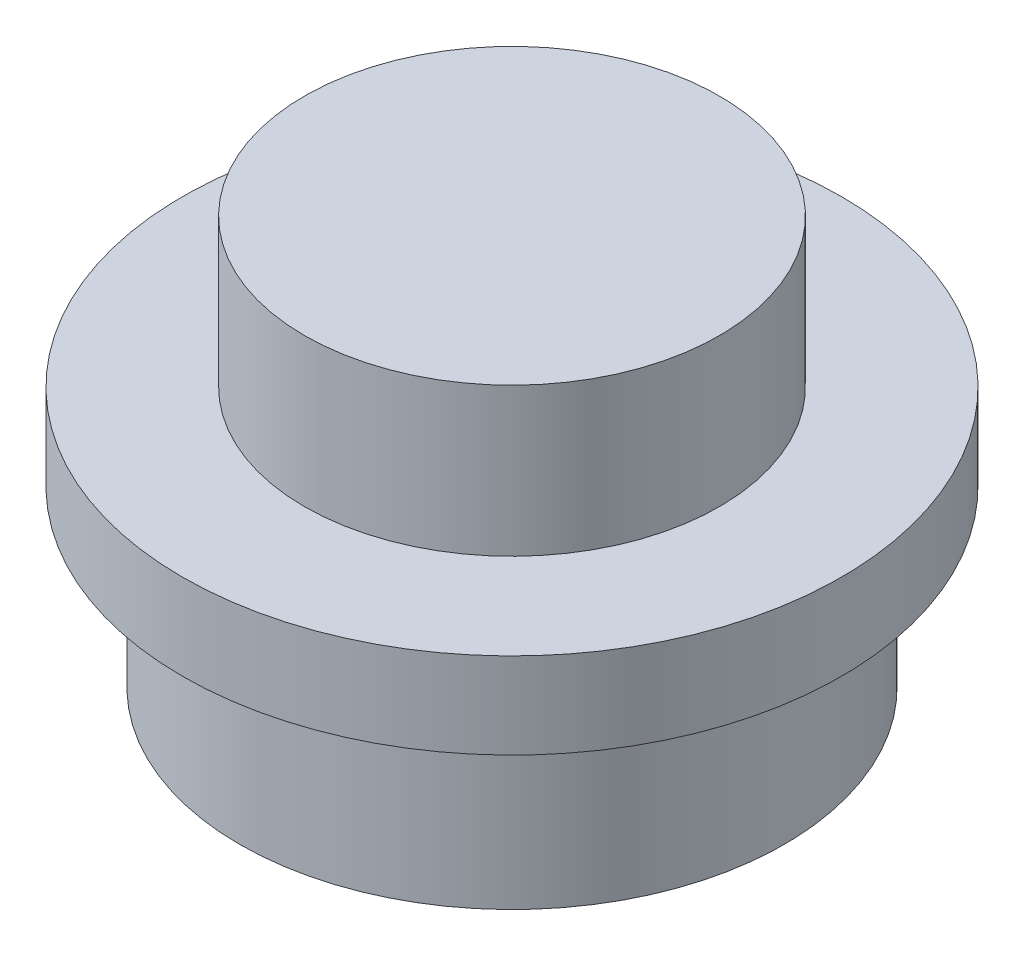
ISO-10303-21;
HEADER;
FILE_DESCRIPTION(('STEP AP214'),'2;1');
FILE_NAME('part.step','',(''),(''),'','','');
FILE_SCHEMA(('AUTOMOTIVE_DESIGN { 1 0 10303 214 1 1 1 1 }'));
ENDSEC;
DATA;
#1=APPLICATION_CONTEXT('core data for automotive mechanical design processes');
#2=APPLICATION_PROTOCOL_DEFINITION('international standard','automotive_design',2000,#1);
#3=PRODUCT_CONTEXT('',#1,'mechanical');
#4=PRODUCT('Part','Part','',(#3));
#5=PRODUCT_RELATED_PRODUCT_CATEGORY('part','',(#4));
#6=PRODUCT_DEFINITION_FORMATION('','',#4);
#7=PRODUCT_DEFINITION_CONTEXT('part definition',#1,'design');
#8=PRODUCT_DEFINITION('design','',#6,#7);
#9=PRODUCT_DEFINITION_SHAPE('','',#8);
#10=(LENGTH_UNIT() NAMED_UNIT(*) SI_UNIT(.MILLI.,.METRE.));
#11=(NAMED_UNIT(*) PLANE_ANGLE_UNIT() SI_UNIT($,.RADIAN.));
#12=(NAMED_UNIT(*) SI_UNIT($,.STERADIAN.) SOLID_ANGLE_UNIT());
#13=UNCERTAINTY_MEASURE_WITH_UNIT(LENGTH_MEASURE(1.E-05),#10,'distance_accuracy_value','');
#14=(GEOMETRIC_REPRESENTATION_CONTEXT(3) GLOBAL_UNCERTAINTY_ASSIGNED_CONTEXT((#13)) GLOBAL_UNIT_ASSIGNED_CONTEXT((#10,
#11,#12)) REPRESENTATION_CONTEXT('',''));
#15=CARTESIAN_POINT('',(0.,0.,0.));
#16=DIRECTION('',(0.,0.,1.));
#17=DIRECTION('',(1.,0.,0.));
#18=AXIS2_PLACEMENT_3D('',#15,#16,#17);
#19=CARTESIAN_POINT('',(0.,2.78,0.));
#20=DIRECTION('',(0.,-1.,0.));
#21=DIRECTION('',(0.,0.,-1.));
#22=AXIS2_PLACEMENT_3D('',#19,#20,#21);
#23=PLANE('',#22);
#24=CARTESIAN_POINT('',(0.,2.78,0.));
#25=DIRECTION('',(0.,1.,0.));
#26=DIRECTION('',(0.,0.,1.));
#27=AXIS2_PLACEMENT_3D('',#24,#25,#26);
#28=CIRCLE('',#27,2.465);
#29=CARTESIAN_POINT('',(0.,2.78,2.465));
#30=VERTEX_POINT('',#29);
#31=EDGE_CURVE('E10',#30,#30,#28,.T.);
#32=ORIENTED_EDGE('',*,*,#31,.T.);
#33=EDGE_LOOP('',(#32));
#34=FACE_BOUND('',#33,.T.);
#35=ADVANCED_FACE('F31',(#34),#23,.F.);
#36=CARTESIAN_POINT('',(0.,3.06153846153846,0.));
#37=DIRECTION('',(0.,1.,0.));
#38=DIRECTION('',(0.,0.,1.));
#39=AXIS2_PLACEMENT_3D('',#36,#37,#38);
#40=CYLINDRICAL_SURFACE('',#39,2.465);
#41=ORIENTED_EDGE('',*,*,#31,.F.);
#42=EDGE_LOOP('',(#41));
#43=FACE_BOUND('',#42,.T.);
#44=CARTESIAN_POINT('',(0.,1.02,0.));
#45=DIRECTION('',(0.,1.,0.));
#46=DIRECTION('',(0.,0.,1.));
#47=AXIS2_PLACEMENT_3D('',#44,#45,#46);
#48=CIRCLE('',#47,2.465);
#49=CARTESIAN_POINT('',(0.,1.02,2.465));
#50=VERTEX_POINT('',#49);
#51=EDGE_CURVE('E37',#50,#50,#48,.T.);
#52=ORIENTED_EDGE('',*,*,#51,.T.);
#53=EDGE_LOOP('',(#52));
#54=FACE_BOUND('',#53,.T.);
#55=ADVANCED_FACE('F81',(#43,#54),#40,.T.);
#56=CARTESIAN_POINT('',(2.465,1.02,0.));
#57=DIRECTION('',(0.,-1.,0.));
#58=DIRECTION('',(0.,0.,-1.));
#59=AXIS2_PLACEMENT_3D('',#56,#57,#58);
#60=PLANE('',#59);
#61=ORIENTED_EDGE('',*,*,#51,.F.);
#62=EDGE_LOOP('',(#61));
#63=FACE_BOUND('',#62,.T.);
#64=CARTESIAN_POINT('',(0.,1.02,0.));
#65=DIRECTION('',(0.,1.,0.));
#66=DIRECTION('',(0.,0.,1.));
#67=AXIS2_PLACEMENT_3D('',#64,#65,#66);
#68=CIRCLE('',#67,3.915);
#69=CARTESIAN_POINT('',(0.,1.02,3.915));
#70=VERTEX_POINT('',#69);
#71=EDGE_CURVE('E41',#70,#70,#68,.T.);
#72=ORIENTED_EDGE('',*,*,#71,.T.);
#73=EDGE_LOOP('',(#72));
#74=FACE_BOUND('',#73,.T.);
#75=ADVANCED_FACE('F85',(#63,#74),#60,.F.);
#76=CARTESIAN_POINT('',(0.,3.06153846153846,0.));
#77=DIRECTION('',(0.,1.,0.));
#78=DIRECTION('',(0.,0.,1.));
#79=AXIS2_PLACEMENT_3D('',#76,#77,#78);
#80=CYLINDRICAL_SURFACE('',#79,3.915);
#81=ORIENTED_EDGE('',*,*,#71,.F.);
#82=EDGE_LOOP('',(#81));
#83=FACE_BOUND('',#82,.T.);
#84=CARTESIAN_POINT('',(0.,0.,0.));
#85=DIRECTION('',(0.,1.,0.));
#86=DIRECTION('',(0.,0.,1.));
#87=AXIS2_PLACEMENT_3D('',#84,#85,#86);
#88=CIRCLE('',#87,3.915);
#89=CARTESIAN_POINT('',(0.,0.,3.915));
#90=VERTEX_POINT('',#89);
#91=EDGE_CURVE('E45',#90,#90,#88,.T.);
#92=ORIENTED_EDGE('',*,*,#91,.T.);
#93=EDGE_LOOP('',(#92));
#94=FACE_BOUND('',#93,.T.);
#95=ADVANCED_FACE('F90',(#83,#94),#80,.T.);
#96=CARTESIAN_POINT('',(3.915,0.,0.));
#97=DIRECTION('',(0.,1.,0.));
#98=DIRECTION('',(0.,0.,1.));
#99=AXIS2_PLACEMENT_3D('',#96,#97,#98);
#100=PLANE('',#99);
#101=ORIENTED_EDGE('',*,*,#91,.F.);
#102=EDGE_LOOP('',(#101));
#103=FACE_BOUND('',#102,.T.);
#104=CARTESIAN_POINT('',(0.,0.,0.));
#105=DIRECTION('',(0.,1.,0.));
#106=DIRECTION('',(0.,0.,1.));
#107=AXIS2_PLACEMENT_3D('',#104,#105,#106);
#108=CIRCLE('',#107,3.235);
#109=CARTESIAN_POINT('',(0.,0.,3.235));
#110=VERTEX_POINT('',#109);
#111=EDGE_CURVE('E50',#110,#110,#108,.T.);
#112=ORIENTED_EDGE('',*,*,#111,.T.);
#113=EDGE_LOOP('',(#112));
#114=FACE_BOUND('',#113,.T.);
#115=ADVANCED_FACE('F96',(#103,#114),#100,.F.);
#116=CARTESIAN_POINT('',(0.,3.06153846153846,0.));
#117=DIRECTION('',(0.,1.,0.));
#118=DIRECTION('',(0.,0.,1.));
#119=AXIS2_PLACEMENT_3D('',#116,#117,#118);
#120=CYLINDRICAL_SURFACE('',#119,3.235);
#121=ORIENTED_EDGE('',*,*,#111,.F.);
#122=EDGE_LOOP('',(#121));
#123=FACE_BOUND('',#122,.T.);
#124=CARTESIAN_POINT('',(0.,-2.07,0.));
#125=DIRECTION('',(0.,1.,0.));
#126=DIRECTION('',(0.,0.,1.));
#127=AXIS2_PLACEMENT_3D('',#124,#125,#126);
#128=CIRCLE('',#127,3.235);
#129=CARTESIAN_POINT('',(0.,-2.07,3.235));
#130=VERTEX_POINT('',#129);
#131=EDGE_CURVE('E53',#130,#130,#128,.T.);
#132=ORIENTED_EDGE('',*,*,#131,.T.);
#133=EDGE_LOOP('',(#132));
#134=FACE_BOUND('',#133,.T.);
#135=ADVANCED_FACE('F100',(#123,#134),#120,.T.);
#136=CARTESIAN_POINT('',(3.235,-2.07,0.));
#137=DIRECTION('',(0.,1.,0.));
#138=DIRECTION('',(0.,0.,1.));
#139=AXIS2_PLACEMENT_3D('',#136,#137,#138);
#140=PLANE('',#139);
#141=ORIENTED_EDGE('',*,*,#131,.F.);
#142=EDGE_LOOP('',(#141));
#143=FACE_BOUND('',#142,.T.);
#144=CARTESIAN_POINT('',(0.,-2.07,0.));
#145=DIRECTION('',(0.,1.,0.));
#146=DIRECTION('',(0.,0.,1.));
#147=AXIS2_PLACEMENT_3D('',#144,#145,#146);
#148=CIRCLE('',#147,2.445);
#149=CARTESIAN_POINT('',(0.,-2.07,2.445));
#150=VERTEX_POINT('',#149);
#151=EDGE_CURVE('E56',#150,#150,#148,.T.);
#152=ORIENTED_EDGE('',*,*,#151,.T.);
#153=EDGE_LOOP('',(#152));
#154=FACE_BOUND('',#153,.T.);
#155=ADVANCED_FACE('F104',(#143,#154),#140,.F.);
#156=CARTESIAN_POINT('',(0.,3.06153846153846,0.));
#157=DIRECTION('',(0.,1.,0.));
#158=DIRECTION('',(0.,0.,1.));
#159=AXIS2_PLACEMENT_3D('',#156,#157,#158);
#160=CYLINDRICAL_SURFACE('',#159,2.445);
#161=ORIENTED_EDGE('',*,*,#151,.F.);
#162=EDGE_LOOP('',(#161));
#163=FACE_BOUND('',#162,.T.);
#164=CARTESIAN_POINT('',(0.,0.,0.));
#165=DIRECTION('',(0.,1.,0.));
#166=DIRECTION('',(0.,0.,1.));
#167=AXIS2_PLACEMENT_3D('',#164,#165,#166);
#168=CIRCLE('',#167,2.445);
#169=CARTESIAN_POINT('',(0.,0.,2.445));
#170=VERTEX_POINT('',#169);
#171=EDGE_CURVE('E59',#170,#170,#168,.T.);
#172=ORIENTED_EDGE('',*,*,#171,.T.);
#173=EDGE_LOOP('',(#172));
#174=FACE_BOUND('',#173,.T.);
#175=ADVANCED_FACE('F108',(#163,#174),#160,.F.);
#176=CARTESIAN_POINT('',(2.445,0.,0.));
#177=DIRECTION('',(0.,1.,0.));
#178=DIRECTION('',(0.,0.,1.));
#179=AXIS2_PLACEMENT_3D('',#176,#177,#178);
#180=PLANE('',#179);
#181=ORIENTED_EDGE('',*,*,#171,.F.);
#182=EDGE_LOOP('',(#181));
#183=FACE_BOUND('',#182,.T.);
#184=CARTESIAN_POINT('',(0.,0.,0.));
#185=DIRECTION('',(0.,1.,0.));
#186=DIRECTION('',(0.,0.,1.));
#187=AXIS2_PLACEMENT_3D('',#184,#185,#186);
#188=CIRCLE('',#187,1.345);
#189=CARTESIAN_POINT('',(0.,0.,1.345));
#190=VERTEX_POINT('',#189);
#191=EDGE_CURVE('E62',#190,#190,#188,.T.);
#192=ORIENTED_EDGE('',*,*,#191,.T.);
#193=EDGE_LOOP('',(#192));
#194=FACE_BOUND('',#193,.T.);
#195=ADVANCED_FACE('F77',(#183,#194),#180,.F.);
#196=CARTESIAN_POINT('',(0.,3.06153846153846,0.));
#197=DIRECTION('',(0.,1.,0.));
#198=DIRECTION('',(0.,0.,1.));
#199=AXIS2_PLACEMENT_3D('',#196,#197,#198);
#200=CYLINDRICAL_SURFACE('',#199,1.345);
#201=ORIENTED_EDGE('',*,*,#191,.F.);
#202=EDGE_LOOP('',(#201));
#203=FACE_BOUND('',#202,.T.);
#204=CARTESIAN_POINT('',(0.,1.8,0.));
#205=DIRECTION('',(0.,1.,0.));
#206=DIRECTION('',(0.,0.,1.));
#207=AXIS2_PLACEMENT_3D('',#204,#205,#206);
#208=CIRCLE('',#207,1.345);
#209=CARTESIAN_POINT('',(0.,1.8,1.345));
#210=VERTEX_POINT('',#209);
#211=EDGE_CURVE('E65',#210,#210,#208,.T.);
#212=ORIENTED_EDGE('',*,*,#211,.T.);
#213=EDGE_LOOP('',(#212));
#214=FACE_BOUND('',#213,.T.);
#215=ADVANCED_FACE('F69',(#203,#214),#200,.F.);
#216=CARTESIAN_POINT('',(1.345,1.8,0.));
#217=DIRECTION('',(0.,1.,0.));
#218=DIRECTION('',(0.,0.,1.));
#219=AXIS2_PLACEMENT_3D('',#216,#217,#218);
#220=PLANE('',#219);
#221=ORIENTED_EDGE('',*,*,#211,.F.);
#222=EDGE_LOOP('',(#221));
#223=FACE_BOUND('',#222,.T.);
#224=ADVANCED_FACE('F71',(#223),#220,.F.);
#225=CLOSED_SHELL('',(#35,#55,#75,#95,#115,#135,#155,#175,#195,#215,#224));
#226=MANIFOLD_SOLID_BREP('B2',#225);
#227=ADVANCED_BREP_SHAPE_REPRESENTATION('',(#18,#226),#14);
#228=SHAPE_DEFINITION_REPRESENTATION(#9,#227);
ENDSEC;
END-ISO-10303-21;
